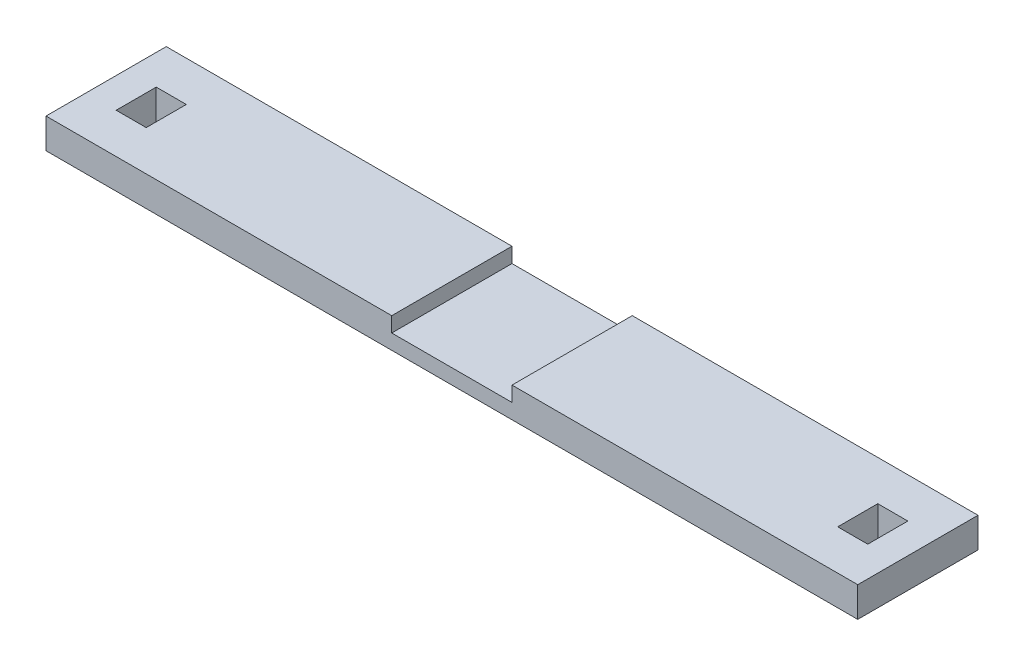
ISO-10303-21;
HEADER;
FILE_DESCRIPTION(('STEP AP214'),'2;1');
FILE_NAME('part.step','',(''),(''),'','','');
FILE_SCHEMA(('AUTOMOTIVE_DESIGN { 1 0 10303 214 1 1 1 1 }'));
ENDSEC;
DATA;
#1=APPLICATION_CONTEXT('core data for automotive mechanical design processes');
#2=APPLICATION_PROTOCOL_DEFINITION('international standard','automotive_design',2000,#1);
#3=PRODUCT_CONTEXT('',#1,'mechanical');
#4=PRODUCT('Part','Part','',(#3));
#5=PRODUCT_RELATED_PRODUCT_CATEGORY('part','',(#4));
#6=PRODUCT_DEFINITION_FORMATION('','',#4);
#7=PRODUCT_DEFINITION_CONTEXT('part definition',#1,'design');
#8=PRODUCT_DEFINITION('design','',#6,#7);
#9=PRODUCT_DEFINITION_SHAPE('','',#8);
#10=(LENGTH_UNIT() NAMED_UNIT(*) SI_UNIT(.MILLI.,.METRE.));
#11=(NAMED_UNIT(*) PLANE_ANGLE_UNIT() SI_UNIT($,.RADIAN.));
#12=(NAMED_UNIT(*) SI_UNIT($,.STERADIAN.) SOLID_ANGLE_UNIT());
#13=UNCERTAINTY_MEASURE_WITH_UNIT(LENGTH_MEASURE(1.E-05),#10,'distance_accuracy_value','');
#14=(GEOMETRIC_REPRESENTATION_CONTEXT(3) GLOBAL_UNCERTAINTY_ASSIGNED_CONTEXT((#13)) GLOBAL_UNIT_ASSIGNED_CONTEXT((#10,
#11,#12)) REPRESENTATION_CONTEXT('',''));
#15=CARTESIAN_POINT('',(0.,0.,0.));
#16=DIRECTION('',(0.,0.,1.));
#17=DIRECTION('',(1.,0.,0.));
#18=AXIS2_PLACEMENT_3D('',#15,#16,#17);
#19=CARTESIAN_POINT('',(0.,6.35,0.));
#20=DIRECTION('',(0.,1.,0.));
#21=DIRECTION('',(0.,0.,1.));
#22=AXIS2_PLACEMENT_3D('',#19,#20,#21);
#23=PLANE('',#22);
#24=DIRECTION('',(0.,0.,1.));
#25=VECTOR('',#24,1.);
#26=CARTESIAN_POINT('',(73.025,6.35,0.));
#27=LINE('',#26,#25);
#28=CARTESIAN_POINT('',(73.025,6.35,0.));
#29=VERTEX_POINT('',#28);
#30=CARTESIAN_POINT('',(73.025,6.35,25.4));
#31=VERTEX_POINT('',#30);
#32=EDGE_CURVE('E151',#29,#31,#27,.T.);
#33=ORIENTED_EDGE('',*,*,#32,.F.);
#34=DIRECTION('',(-1.,0.,0.));
#35=VECTOR('',#34,1.);
#36=CARTESIAN_POINT('',(0.,6.35,0.));
#37=LINE('',#36,#35);
#38=CARTESIAN_POINT('',(0.,6.35,0.));
#39=VERTEX_POINT('',#38);
#40=EDGE_CURVE('E253',#29,#39,#37,.T.);
#41=ORIENTED_EDGE('',*,*,#40,.T.);
#42=DIRECTION('',(0.,0.,1.));
#43=VECTOR('',#42,1.);
#44=CARTESIAN_POINT('',(0.,6.35,0.));
#45=LINE('',#44,#43);
#46=CARTESIAN_POINT('',(0.,6.35,25.4));
#47=VERTEX_POINT('',#46);
#48=EDGE_CURVE('E244',#39,#47,#45,.T.);
#49=ORIENTED_EDGE('',*,*,#48,.T.);
#50=DIRECTION('',(1.,0.,0.));
#51=VECTOR('',#50,1.);
#52=CARTESIAN_POINT('',(0.,6.35,25.4));
#53=LINE('',#52,#51);
#54=EDGE_CURVE('E249',#47,#31,#53,.T.);
#55=ORIENTED_EDGE('',*,*,#54,.T.);
#56=EDGE_LOOP('',(#33,#41,#49,#55));
#57=FACE_BOUND('',#56,.T.);
#58=DIRECTION('',(0.,0.,1.));
#59=VECTOR('',#58,1.);
#60=CARTESIAN_POINT('',(6.35,6.35,16.9333333333333));
#61=LINE('',#60,#59);
#62=CARTESIAN_POINT('',(6.35,6.35,8.46666666666667));
#63=VERTEX_POINT('',#62);
#64=CARTESIAN_POINT('',(6.35,6.35,16.9333333333333));
#65=VERTEX_POINT('',#64);
#66=EDGE_CURVE('E177',#63,#65,#61,.T.);
#67=ORIENTED_EDGE('',*,*,#66,.F.);
#68=DIRECTION('',(-1.,0.,0.));
#69=VECTOR('',#68,1.);
#70=CARTESIAN_POINT('',(6.35,6.35,8.46666666666667));
#71=LINE('',#70,#69);
#72=CARTESIAN_POINT('',(12.7,6.35,8.46666666666667));
#73=VERTEX_POINT('',#72);
#74=EDGE_CURVE('E218',#73,#63,#71,.T.);
#75=ORIENTED_EDGE('',*,*,#74,.F.);
#76=DIRECTION('',(0.,0.,-1.));
#77=VECTOR('',#76,1.);
#78=CARTESIAN_POINT('',(12.7,6.35,16.9333333333333));
#79=LINE('',#78,#77);
#80=CARTESIAN_POINT('',(12.7,6.35,16.9333333333333));
#81=VERTEX_POINT('',#80);
#82=EDGE_CURVE('E232',#81,#73,#79,.T.);
#83=ORIENTED_EDGE('',*,*,#82,.F.);
#84=DIRECTION('',(1.,0.,0.));
#85=VECTOR('',#84,1.);
#86=CARTESIAN_POINT('',(6.35,6.35,16.9333333333333));
#87=LINE('',#86,#85);
#88=EDGE_CURVE('E229',#65,#81,#87,.T.);
#89=ORIENTED_EDGE('',*,*,#88,.F.);
#90=EDGE_LOOP('',(#67,#75,#83,#89));
#91=FACE_BOUND('',#90,.T.);
#92=ADVANCED_FACE('F33',(#57,#91),#23,.T.);
#93=CARTESIAN_POINT('',(0.,6.35,0.));
#94=DIRECTION('',(1.,0.,0.));
#95=DIRECTION('',(0.,0.,-1.));
#96=AXIS2_PLACEMENT_3D('',#93,#94,#95);
#97=PLANE('',#96);
#98=DIRECTION('',(0.,0.,1.));
#99=VECTOR('',#98,1.);
#100=CARTESIAN_POINT('',(0.,0.,0.));
#101=LINE('',#100,#99);
#102=CARTESIAN_POINT('',(0.,0.,0.));
#103=VERTEX_POINT('',#102);
#104=CARTESIAN_POINT('',(0.,0.,25.4));
#105=VERTEX_POINT('',#104);
#106=EDGE_CURVE('E208',#103,#105,#101,.T.);
#107=ORIENTED_EDGE('',*,*,#106,.T.);
#108=DIRECTION('',(0.,-1.,0.));
#109=VECTOR('',#108,1.);
#110=CARTESIAN_POINT('',(0.,6.35,25.4));
#111=LINE('',#110,#109);
#112=EDGE_CURVE('E11',#47,#105,#111,.T.);
#113=ORIENTED_EDGE('',*,*,#112,.F.);
#114=ORIENTED_EDGE('',*,*,#48,.F.);
#115=DIRECTION('',(0.,-1.,0.));
#116=VECTOR('',#115,1.);
#117=CARTESIAN_POINT('',(0.,6.35,0.));
#118=LINE('',#117,#116);
#119=EDGE_CURVE('E257',#39,#103,#118,.T.);
#120=ORIENTED_EDGE('',*,*,#119,.T.);
#121=EDGE_LOOP('',(#107,#113,#114,#120));
#122=FACE_BOUND('',#121,.T.);
#123=ADVANCED_FACE('F35',(#122),#97,.F.);
#124=CARTESIAN_POINT('',(0.,6.35,25.4));
#125=DIRECTION('',(0.,0.,-1.));
#126=DIRECTION('',(-1.,0.,0.));
#127=AXIS2_PLACEMENT_3D('',#124,#125,#126);
#128=PLANE('',#127);
#129=DIRECTION('',(1.,0.,0.));
#130=VECTOR('',#129,1.);
#131=CARTESIAN_POINT('',(73.025,3.175,25.4));
#132=LINE('',#131,#130);
#133=CARTESIAN_POINT('',(73.025,3.175,25.4));
#134=VERTEX_POINT('',#133);
#135=CARTESIAN_POINT('',(98.425,3.175,25.4));
#136=VERTEX_POINT('',#135);
#137=EDGE_CURVE('E161',#134,#136,#132,.T.);
#138=ORIENTED_EDGE('',*,*,#137,.F.);
#139=DIRECTION('',(0.,1.,0.));
#140=VECTOR('',#139,1.);
#141=CARTESIAN_POINT('',(73.025,3.175,25.4));
#142=LINE('',#141,#140);
#143=EDGE_CURVE('E145',#134,#31,#142,.T.);
#144=ORIENTED_EDGE('',*,*,#143,.T.);
#145=ORIENTED_EDGE('',*,*,#54,.F.);
#146=ORIENTED_EDGE('',*,*,#112,.T.);
#147=DIRECTION('',(1.,0.,0.));
#148=VECTOR('',#147,1.);
#149=CARTESIAN_POINT('',(0.,0.,25.4));
#150=LINE('',#149,#148);
#151=CARTESIAN_POINT('',(171.45,0.,25.4));
#152=VERTEX_POINT('',#151);
#153=EDGE_CURVE('E260',#105,#152,#150,.T.);
#154=ORIENTED_EDGE('',*,*,#153,.T.);
#155=DIRECTION('',(0.,-1.,0.));
#156=VECTOR('',#155,1.);
#157=CARTESIAN_POINT('',(171.45,6.35,25.4));
#158=LINE('',#157,#156);
#159=CARTESIAN_POINT('',(171.45,6.35,25.4));
#160=VERTEX_POINT('',#159);
#161=EDGE_CURVE('E41',#160,#152,#158,.T.);
#162=ORIENTED_EDGE('',*,*,#161,.F.);
#163=CARTESIAN_POINT('',(98.425,6.35,25.4));
#164=VERTEX_POINT('',#163);
#165=EDGE_CURVE('E247',#164,#160,#53,.T.);
#166=ORIENTED_EDGE('',*,*,#165,.F.);
#167=DIRECTION('',(0.,1.,0.));
#168=VECTOR('',#167,1.);
#169=CARTESIAN_POINT('',(98.425,3.175,25.4));
#170=LINE('',#169,#168);
#171=EDGE_CURVE('E48',#136,#164,#170,.T.);
#172=ORIENTED_EDGE('',*,*,#171,.F.);
#173=EDGE_LOOP('',(#138,#144,#145,#146,#154,#162,#166,#172));
#174=FACE_BOUND('',#173,.T.);
#175=ADVANCED_FACE('F166',(#174),#128,.F.);
#176=CARTESIAN_POINT('',(171.45,6.35,0.));
#177=DIRECTION('',(-1.,0.,0.));
#178=DIRECTION('',(0.,0.,1.));
#179=AXIS2_PLACEMENT_3D('',#176,#177,#178);
#180=PLANE('',#179);
#181=DIRECTION('',(0.,0.,-1.));
#182=VECTOR('',#181,1.);
#183=CARTESIAN_POINT('',(171.45,0.,0.));
#184=LINE('',#183,#182);
#185=CARTESIAN_POINT('',(171.45,0.,0.));
#186=VERTEX_POINT('',#185);
#187=EDGE_CURVE('E262',#152,#186,#184,.T.);
#188=ORIENTED_EDGE('',*,*,#187,.T.);
#189=DIRECTION('',(0.,-1.,0.));
#190=VECTOR('',#189,1.);
#191=CARTESIAN_POINT('',(171.45,6.35,0.));
#192=LINE('',#191,#190);
#193=CARTESIAN_POINT('',(171.45,6.35,0.));
#194=VERTEX_POINT('',#193);
#195=EDGE_CURVE('E267',#194,#186,#192,.T.);
#196=ORIENTED_EDGE('',*,*,#195,.F.);
#197=DIRECTION('',(0.,0.,-1.));
#198=VECTOR('',#197,1.);
#199=CARTESIAN_POINT('',(171.45,6.35,0.));
#200=LINE('',#199,#198);
#201=EDGE_CURVE('E251',#160,#194,#200,.T.);
#202=ORIENTED_EDGE('',*,*,#201,.F.);
#203=ORIENTED_EDGE('',*,*,#161,.T.);
#204=EDGE_LOOP('',(#188,#196,#202,#203));
#205=FACE_BOUND('',#204,.T.);
#206=ADVANCED_FACE('F274',(#205),#180,.F.);
#207=CARTESIAN_POINT('',(0.,6.35,0.));
#208=DIRECTION('',(0.,0.,1.));
#209=DIRECTION('',(1.,0.,0.));
#210=AXIS2_PLACEMENT_3D('',#207,#208,#209);
#211=PLANE('',#210);
#212=ORIENTED_EDGE('',*,*,#40,.F.);
#213=DIRECTION('',(0.,1.,0.));
#214=VECTOR('',#213,1.);
#215=CARTESIAN_POINT('',(73.025,3.175,0.));
#216=LINE('',#215,#214);
#217=CARTESIAN_POINT('',(73.025,3.175,0.));
#218=VERTEX_POINT('',#217);
#219=EDGE_CURVE('E175',#218,#29,#216,.T.);
#220=ORIENTED_EDGE('',*,*,#219,.F.);
#221=DIRECTION('',(-1.,0.,0.));
#222=VECTOR('',#221,1.);
#223=CARTESIAN_POINT('',(73.025,3.175,0.));
#224=LINE('',#223,#222);
#225=CARTESIAN_POINT('',(98.425,3.175,0.));
#226=VERTEX_POINT('',#225);
#227=EDGE_CURVE('E155',#226,#218,#224,.T.);
#228=ORIENTED_EDGE('',*,*,#227,.F.);
#229=DIRECTION('',(0.,1.,0.));
#230=VECTOR('',#229,1.);
#231=CARTESIAN_POINT('',(98.425,3.175,0.));
#232=LINE('',#231,#230);
#233=CARTESIAN_POINT('',(98.425,6.35,0.));
#234=VERTEX_POINT('',#233);
#235=EDGE_CURVE('E178',#226,#234,#232,.T.);
#236=ORIENTED_EDGE('',*,*,#235,.T.);
#237=EDGE_CURVE('E254',#194,#234,#37,.T.);
#238=ORIENTED_EDGE('',*,*,#237,.F.);
#239=ORIENTED_EDGE('',*,*,#195,.T.);
#240=DIRECTION('',(-1.,0.,0.));
#241=VECTOR('',#240,1.);
#242=CARTESIAN_POINT('',(0.,0.,0.));
#243=LINE('',#242,#241);
#244=EDGE_CURVE('E248',#186,#103,#243,.T.);
#245=ORIENTED_EDGE('',*,*,#244,.T.);
#246=ORIENTED_EDGE('',*,*,#119,.F.);
#247=EDGE_LOOP('',(#212,#220,#228,#236,#238,#239,#245,#246));
#248=FACE_BOUND('',#247,.T.);
#249=ADVANCED_FACE('F283',(#248),#211,.F.);
#250=DIRECTION('',(0.,0.,-1.));
#251=VECTOR('',#250,1.);
#252=CARTESIAN_POINT('',(98.425,6.35,0.));
#253=LINE('',#252,#251);
#254=EDGE_CURVE('E164',#164,#234,#253,.T.);
#255=ORIENTED_EDGE('',*,*,#254,.F.);
#256=ORIENTED_EDGE('',*,*,#165,.T.);
#257=ORIENTED_EDGE('',*,*,#201,.T.);
#258=ORIENTED_EDGE('',*,*,#237,.T.);
#259=EDGE_LOOP('',(#255,#256,#257,#258));
#260=FACE_BOUND('',#259,.T.);
#261=DIRECTION('',(0.,0.,1.));
#262=VECTOR('',#261,1.);
#263=CARTESIAN_POINT('',(158.75,6.35,16.9333333333333));
#264=LINE('',#263,#262);
#265=CARTESIAN_POINT('',(158.75,6.35,8.46666666666667));
#266=VERTEX_POINT('',#265);
#267=CARTESIAN_POINT('',(158.75,6.35,16.9333333333333));
#268=VERTEX_POINT('',#267);
#269=EDGE_CURVE('E56',#266,#268,#264,.T.);
#270=ORIENTED_EDGE('',*,*,#269,.F.);
#271=DIRECTION('',(-1.,0.,0.));
#272=VECTOR('',#271,1.);
#273=CARTESIAN_POINT('',(158.75,6.35,8.46666666666667));
#274=LINE('',#273,#272);
#275=CARTESIAN_POINT('',(165.1,6.35,8.46666666666667));
#276=VERTEX_POINT('',#275);
#277=EDGE_CURVE('E186',#276,#266,#274,.T.);
#278=ORIENTED_EDGE('',*,*,#277,.F.);
#279=DIRECTION('',(0.,0.,-1.));
#280=VECTOR('',#279,1.);
#281=CARTESIAN_POINT('',(165.1,6.35,16.9333333333333));
#282=LINE('',#281,#280);
#283=CARTESIAN_POINT('',(165.1,6.35,16.9333333333333));
#284=VERTEX_POINT('',#283);
#285=EDGE_CURVE('E201',#284,#276,#282,.T.);
#286=ORIENTED_EDGE('',*,*,#285,.F.);
#287=DIRECTION('',(1.,0.,0.));
#288=VECTOR('',#287,1.);
#289=CARTESIAN_POINT('',(158.75,6.35,16.9333333333333));
#290=LINE('',#289,#288);
#291=EDGE_CURVE('E197',#268,#284,#290,.T.);
#292=ORIENTED_EDGE('',*,*,#291,.F.);
#293=EDGE_LOOP('',(#270,#278,#286,#292));
#294=FACE_BOUND('',#293,.T.);
#295=ADVANCED_FACE('F291',(#260,#294),#23,.T.);
#296=CARTESIAN_POINT('',(0.,0.,0.));
#297=DIRECTION('',(0.,1.,0.));
#298=DIRECTION('',(0.,0.,1.));
#299=AXIS2_PLACEMENT_3D('',#296,#297,#298);
#300=PLANE('',#299);
#301=DIRECTION('',(-1.,0.,0.));
#302=VECTOR('',#301,1.);
#303=CARTESIAN_POINT('',(158.75,0.,8.46666666666667));
#304=LINE('',#303,#302);
#305=CARTESIAN_POINT('',(165.1,0.,8.46666666666667));
#306=VERTEX_POINT('',#305);
#307=CARTESIAN_POINT('',(158.75,0.,8.46666666666667));
#308=VERTEX_POINT('',#307);
#309=EDGE_CURVE('E192',#306,#308,#304,.T.);
#310=ORIENTED_EDGE('',*,*,#309,.T.);
#311=DIRECTION('',(0.,0.,1.));
#312=VECTOR('',#311,1.);
#313=CARTESIAN_POINT('',(158.75,0.,16.9333333333333));
#314=LINE('',#313,#312);
#315=CARTESIAN_POINT('',(158.75,0.,16.9333333333333));
#316=VERTEX_POINT('',#315);
#317=EDGE_CURVE('E182',#308,#316,#314,.T.);
#318=ORIENTED_EDGE('',*,*,#317,.T.);
#319=DIRECTION('',(1.,0.,0.));
#320=VECTOR('',#319,1.);
#321=CARTESIAN_POINT('',(158.75,0.,16.9333333333333));
#322=LINE('',#321,#320);
#323=CARTESIAN_POINT('',(165.1,0.,16.9333333333333));
#324=VERTEX_POINT('',#323);
#325=EDGE_CURVE('E185',#316,#324,#322,.T.);
#326=ORIENTED_EDGE('',*,*,#325,.T.);
#327=DIRECTION('',(0.,0.,-1.));
#328=VECTOR('',#327,1.);
#329=CARTESIAN_POINT('',(165.1,0.,16.9333333333333));
#330=LINE('',#329,#328);
#331=EDGE_CURVE('E189',#324,#306,#330,.T.);
#332=ORIENTED_EDGE('',*,*,#331,.T.);
#333=EDGE_LOOP('',(#310,#318,#326,#332));
#334=FACE_BOUND('',#333,.T.);
#335=DIRECTION('',(-1.,0.,0.));
#336=VECTOR('',#335,1.);
#337=CARTESIAN_POINT('',(6.35,0.,8.46666666666667));
#338=LINE('',#337,#336);
#339=CARTESIAN_POINT('',(12.7,0.,8.46666666666667));
#340=VERTEX_POINT('',#339);
#341=CARTESIAN_POINT('',(6.35,0.,8.46666666666667));
#342=VERTEX_POINT('',#341);
#343=EDGE_CURVE('E224',#340,#342,#338,.T.);
#344=ORIENTED_EDGE('',*,*,#343,.T.);
#345=DIRECTION('',(0.,0.,1.));
#346=VECTOR('',#345,1.);
#347=CARTESIAN_POINT('',(6.35,0.,16.9333333333333));
#348=LINE('',#347,#346);
#349=CARTESIAN_POINT('',(6.35,0.,16.9333333333333));
#350=VERTEX_POINT('',#349);
#351=EDGE_CURVE('E214',#342,#350,#348,.T.);
#352=ORIENTED_EDGE('',*,*,#351,.T.);
#353=DIRECTION('',(1.,0.,0.));
#354=VECTOR('',#353,1.);
#355=CARTESIAN_POINT('',(6.35,0.,16.9333333333333));
#356=LINE('',#355,#354);
#357=CARTESIAN_POINT('',(12.7,0.,16.9333333333333));
#358=VERTEX_POINT('',#357);
#359=EDGE_CURVE('E217',#350,#358,#356,.T.);
#360=ORIENTED_EDGE('',*,*,#359,.T.);
#361=DIRECTION('',(0.,0.,-1.));
#362=VECTOR('',#361,1.);
#363=CARTESIAN_POINT('',(12.7,0.,16.9333333333333));
#364=LINE('',#363,#362);
#365=EDGE_CURVE('E221',#358,#340,#364,.T.);
#366=ORIENTED_EDGE('',*,*,#365,.T.);
#367=EDGE_LOOP('',(#344,#352,#360,#366));
#368=FACE_BOUND('',#367,.T.);
#369=ORIENTED_EDGE('',*,*,#106,.F.);
#370=ORIENTED_EDGE('',*,*,#244,.F.);
#371=ORIENTED_EDGE('',*,*,#187,.F.);
#372=ORIENTED_EDGE('',*,*,#153,.F.);
#373=EDGE_LOOP('',(#369,#370,#371,#372));
#374=FACE_BOUND('',#373,.T.);
#375=ADVANCED_FACE('F279',(#334,#368,#374),#300,.F.);
#376=CARTESIAN_POINT('',(6.35,0.,16.9333333333333));
#377=DIRECTION('',(-1.,0.,0.));
#378=DIRECTION('',(0.,0.,1.));
#379=AXIS2_PLACEMENT_3D('',#376,#377,#378);
#380=PLANE('',#379);
#381=ORIENTED_EDGE('',*,*,#66,.T.);
#382=DIRECTION('',(0.,1.,0.));
#383=VECTOR('',#382,1.);
#384=CARTESIAN_POINT('',(6.35,0.,16.9333333333333));
#385=LINE('',#384,#383);
#386=EDGE_CURVE('E227',#350,#65,#385,.T.);
#387=ORIENTED_EDGE('',*,*,#386,.F.);
#388=ORIENTED_EDGE('',*,*,#351,.F.);
#389=DIRECTION('',(0.,1.,0.));
#390=VECTOR('',#389,1.);
#391=CARTESIAN_POINT('',(6.35,0.,8.46666666666667));
#392=LINE('',#391,#390);
#393=EDGE_CURVE('E198',#342,#63,#392,.T.);
#394=ORIENTED_EDGE('',*,*,#393,.T.);
#395=EDGE_LOOP('',(#381,#387,#388,#394));
#396=FACE_BOUND('',#395,.T.);
#397=ADVANCED_FACE('F315',(#396),#380,.F.);
#398=CARTESIAN_POINT('',(6.35,0.,8.46666666666667));
#399=DIRECTION('',(0.,0.,-1.));
#400=DIRECTION('',(-1.,0.,0.));
#401=AXIS2_PLACEMENT_3D('',#398,#399,#400);
#402=PLANE('',#401);
#403=ORIENTED_EDGE('',*,*,#74,.T.);
#404=ORIENTED_EDGE('',*,*,#393,.F.);
#405=ORIENTED_EDGE('',*,*,#343,.F.);
#406=DIRECTION('',(0.,1.,0.));
#407=VECTOR('',#406,1.);
#408=CARTESIAN_POINT('',(12.7,0.,8.46666666666667));
#409=LINE('',#408,#407);
#410=EDGE_CURVE('E238',#340,#73,#409,.T.);
#411=ORIENTED_EDGE('',*,*,#410,.T.);
#412=EDGE_LOOP('',(#403,#404,#405,#411));
#413=FACE_BOUND('',#412,.T.);
#414=ADVANCED_FACE('F350',(#413),#402,.F.);
#415=CARTESIAN_POINT('',(12.7,0.,16.9333333333333));
#416=DIRECTION('',(1.,0.,0.));
#417=DIRECTION('',(0.,0.,-1.));
#418=AXIS2_PLACEMENT_3D('',#415,#416,#417);
#419=PLANE('',#418);
#420=ORIENTED_EDGE('',*,*,#82,.T.);
#421=ORIENTED_EDGE('',*,*,#410,.F.);
#422=ORIENTED_EDGE('',*,*,#365,.F.);
#423=DIRECTION('',(0.,1.,0.));
#424=VECTOR('',#423,1.);
#425=CARTESIAN_POINT('',(12.7,0.,16.9333333333333));
#426=LINE('',#425,#424);
#427=EDGE_CURVE('E240',#358,#81,#426,.T.);
#428=ORIENTED_EDGE('',*,*,#427,.T.);
#429=EDGE_LOOP('',(#420,#421,#422,#428));
#430=FACE_BOUND('',#429,.T.);
#431=ADVANCED_FACE('F359',(#430),#419,.F.);
#432=CARTESIAN_POINT('',(6.35,0.,16.9333333333333));
#433=DIRECTION('',(0.,0.,1.));
#434=DIRECTION('',(1.,0.,0.));
#435=AXIS2_PLACEMENT_3D('',#432,#433,#434);
#436=PLANE('',#435);
#437=ORIENTED_EDGE('',*,*,#88,.T.);
#438=ORIENTED_EDGE('',*,*,#427,.F.);
#439=ORIENTED_EDGE('',*,*,#359,.F.);
#440=ORIENTED_EDGE('',*,*,#386,.T.);
#441=EDGE_LOOP('',(#437,#438,#439,#440));
#442=FACE_BOUND('',#441,.T.);
#443=ADVANCED_FACE('F369',(#442),#436,.F.);
#444=CARTESIAN_POINT('',(158.75,0.,16.9333333333333));
#445=DIRECTION('',(-1.,0.,0.));
#446=DIRECTION('',(0.,0.,1.));
#447=AXIS2_PLACEMENT_3D('',#444,#445,#446);
#448=PLANE('',#447);
#449=ORIENTED_EDGE('',*,*,#269,.T.);
#450=DIRECTION('',(0.,1.,0.));
#451=VECTOR('',#450,1.);
#452=CARTESIAN_POINT('',(158.75,0.,16.9333333333333));
#453=LINE('',#452,#451);
#454=EDGE_CURVE('E195',#316,#268,#453,.T.);
#455=ORIENTED_EDGE('',*,*,#454,.F.);
#456=ORIENTED_EDGE('',*,*,#317,.F.);
#457=DIRECTION('',(0.,1.,0.));
#458=VECTOR('',#457,1.);
#459=CARTESIAN_POINT('',(158.75,0.,8.46666666666667));
#460=LINE('',#459,#458);
#461=EDGE_CURVE('E206',#308,#266,#460,.T.);
#462=ORIENTED_EDGE('',*,*,#461,.T.);
#463=EDGE_LOOP('',(#449,#455,#456,#462));
#464=FACE_BOUND('',#463,.T.);
#465=ADVANCED_FACE('F379',(#464),#448,.F.);
#466=CARTESIAN_POINT('',(158.75,0.,8.46666666666667));
#467=DIRECTION('',(0.,0.,-1.));
#468=DIRECTION('',(-1.,0.,0.));
#469=AXIS2_PLACEMENT_3D('',#466,#467,#468);
#470=PLANE('',#469);
#471=ORIENTED_EDGE('',*,*,#277,.T.);
#472=ORIENTED_EDGE('',*,*,#461,.F.);
#473=ORIENTED_EDGE('',*,*,#309,.F.);
#474=DIRECTION('',(0.,1.,0.));
#475=VECTOR('',#474,1.);
#476=CARTESIAN_POINT('',(165.1,0.,8.46666666666667));
#477=LINE('',#476,#475);
#478=EDGE_CURVE('E209',#306,#276,#477,.T.);
#479=ORIENTED_EDGE('',*,*,#478,.T.);
#480=EDGE_LOOP('',(#471,#472,#473,#479));
#481=FACE_BOUND('',#480,.T.);
#482=ADVANCED_FACE('F389',(#481),#470,.F.);
#483=CARTESIAN_POINT('',(165.1,0.,16.9333333333333));
#484=DIRECTION('',(1.,0.,0.));
#485=DIRECTION('',(0.,0.,-1.));
#486=AXIS2_PLACEMENT_3D('',#483,#484,#485);
#487=PLANE('',#486);
#488=ORIENTED_EDGE('',*,*,#285,.T.);
#489=ORIENTED_EDGE('',*,*,#478,.F.);
#490=ORIENTED_EDGE('',*,*,#331,.F.);
#491=DIRECTION('',(0.,1.,0.));
#492=VECTOR('',#491,1.);
#493=CARTESIAN_POINT('',(165.1,0.,16.9333333333333));
#494=LINE('',#493,#492);
#495=EDGE_CURVE('E211',#324,#284,#494,.T.);
#496=ORIENTED_EDGE('',*,*,#495,.T.);
#497=EDGE_LOOP('',(#488,#489,#490,#496));
#498=FACE_BOUND('',#497,.T.);
#499=ADVANCED_FACE('F398',(#498),#487,.F.);
#500=CARTESIAN_POINT('',(158.75,0.,16.9333333333333));
#501=DIRECTION('',(0.,0.,1.));
#502=DIRECTION('',(1.,0.,0.));
#503=AXIS2_PLACEMENT_3D('',#500,#501,#502);
#504=PLANE('',#503);
#505=ORIENTED_EDGE('',*,*,#291,.T.);
#506=ORIENTED_EDGE('',*,*,#495,.F.);
#507=ORIENTED_EDGE('',*,*,#325,.F.);
#508=ORIENTED_EDGE('',*,*,#454,.T.);
#509=EDGE_LOOP('',(#505,#506,#507,#508));
#510=FACE_BOUND('',#509,.T.);
#511=ADVANCED_FACE('F301',(#510),#504,.F.);
#512=CARTESIAN_POINT('',(73.025,3.175,0.));
#513=DIRECTION('',(-1.,0.,0.));
#514=DIRECTION('',(0.,0.,1.));
#515=AXIS2_PLACEMENT_3D('',#512,#513,#514);
#516=PLANE('',#515);
#517=ORIENTED_EDGE('',*,*,#32,.T.);
#518=ORIENTED_EDGE('',*,*,#143,.F.);
#519=DIRECTION('',(0.,0.,1.));
#520=VECTOR('',#519,1.);
#521=CARTESIAN_POINT('',(73.025,3.175,0.));
#522=LINE('',#521,#520);
#523=EDGE_CURVE('E148',#218,#134,#522,.T.);
#524=ORIENTED_EDGE('',*,*,#523,.F.);
#525=ORIENTED_EDGE('',*,*,#219,.T.);
#526=EDGE_LOOP('',(#517,#518,#524,#525));
#527=FACE_BOUND('',#526,.T.);
#528=ADVANCED_FACE('F147',(#527),#516,.F.);
#529=CARTESIAN_POINT('',(98.425,3.175,0.));
#530=DIRECTION('',(1.,0.,0.));
#531=DIRECTION('',(0.,0.,-1.));
#532=AXIS2_PLACEMENT_3D('',#529,#530,#531);
#533=PLANE('',#532);
#534=ORIENTED_EDGE('',*,*,#254,.T.);
#535=ORIENTED_EDGE('',*,*,#235,.F.);
#536=DIRECTION('',(0.,0.,-1.));
#537=VECTOR('',#536,1.);
#538=CARTESIAN_POINT('',(98.425,3.175,0.));
#539=LINE('',#538,#537);
#540=EDGE_CURVE('E168',#136,#226,#539,.T.);
#541=ORIENTED_EDGE('',*,*,#540,.F.);
#542=ORIENTED_EDGE('',*,*,#171,.T.);
#543=EDGE_LOOP('',(#534,#535,#541,#542));
#544=FACE_BOUND('',#543,.T.);
#545=ADVANCED_FACE('F293',(#544),#533,.F.);
#546=CARTESIAN_POINT('',(0.,3.175,0.));
#547=DIRECTION('',(0.,1.,0.));
#548=DIRECTION('',(0.,0.,1.));
#549=AXIS2_PLACEMENT_3D('',#546,#547,#548);
#550=PLANE('',#549);
#551=ORIENTED_EDGE('',*,*,#523,.T.);
#552=ORIENTED_EDGE('',*,*,#137,.T.);
#553=ORIENTED_EDGE('',*,*,#540,.T.);
#554=ORIENTED_EDGE('',*,*,#227,.T.);
#555=EDGE_LOOP('',(#551,#552,#553,#554));
#556=FACE_BOUND('',#555,.T.);
#557=ADVANCED_FACE('F159',(#556),#550,.T.);
#558=CLOSED_SHELL('',(#92,#123,#175,#206,#249,#295,#375,#397,#414,#431,#443,#465,#482,#499,#511,
#528,#545,#557));
#559=MANIFOLD_SOLID_BREP('B2',#558);
#560=ADVANCED_BREP_SHAPE_REPRESENTATION('',(#18,#559),#14);
#561=SHAPE_DEFINITION_REPRESENTATION(#9,#560);
ENDSEC;
END-ISO-10303-21;
